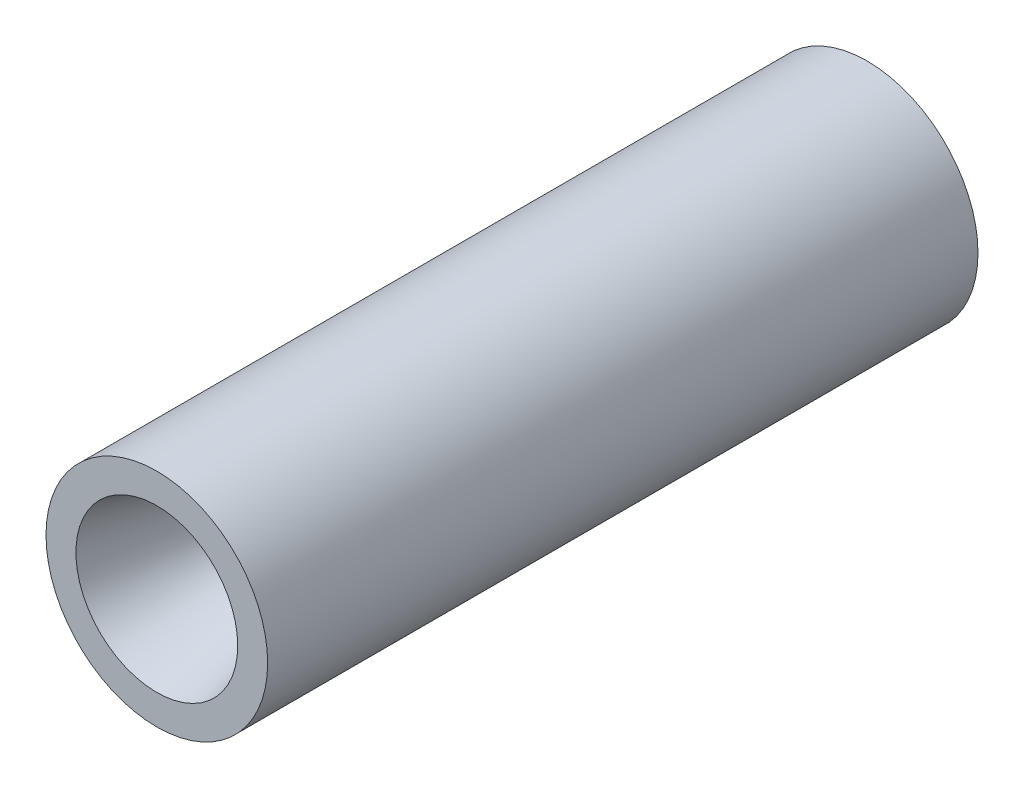
ISO-10303-21;
HEADER;
FILE_DESCRIPTION(('STEP AP214'),'2;1');
FILE_NAME('part.step','',(''),(''),'','','');
FILE_SCHEMA(('AUTOMOTIVE_DESIGN { 1 0 10303 214 1 1 1 1 }'));
ENDSEC;
DATA;
#1=APPLICATION_CONTEXT('core data for automotive mechanical design processes');
#2=APPLICATION_PROTOCOL_DEFINITION('international standard','automotive_design',2000,#1);
#3=PRODUCT_CONTEXT('',#1,'mechanical');
#4=PRODUCT('Part','Part','',(#3));
#5=PRODUCT_RELATED_PRODUCT_CATEGORY('part','',(#4));
#6=PRODUCT_DEFINITION_FORMATION('','',#4);
#7=PRODUCT_DEFINITION_CONTEXT('part definition',#1,'design');
#8=PRODUCT_DEFINITION('design','',#6,#7);
#9=PRODUCT_DEFINITION_SHAPE('','',#8);
#10=(LENGTH_UNIT() NAMED_UNIT(*) SI_UNIT(.MILLI.,.METRE.));
#11=(NAMED_UNIT(*) PLANE_ANGLE_UNIT() SI_UNIT($,.RADIAN.));
#12=(NAMED_UNIT(*) SI_UNIT($,.STERADIAN.) SOLID_ANGLE_UNIT());
#13=UNCERTAINTY_MEASURE_WITH_UNIT(LENGTH_MEASURE(1.E-05),#10,'distance_accuracy_value','');
#14=(GEOMETRIC_REPRESENTATION_CONTEXT(3) GLOBAL_UNCERTAINTY_ASSIGNED_CONTEXT((#13)) GLOBAL_UNIT_ASSIGNED_CONTEXT((#10,
#11,#12)) REPRESENTATION_CONTEXT('',''));
#15=CARTESIAN_POINT('',(0.,0.,0.));
#16=DIRECTION('',(0.,0.,1.));
#17=DIRECTION('',(1.,0.,0.));
#18=AXIS2_PLACEMENT_3D('',#15,#16,#17);
#19=CARTESIAN_POINT('',(0.,0.,81.407));
#20=DIRECTION('',(0.,0.,-1.));
#21=DIRECTION('',(-1.,0.,0.));
#22=AXIS2_PLACEMENT_3D('',#19,#20,#21);
#23=CYLINDRICAL_SURFACE('',#22,25.4);
#24=CARTESIAN_POINT('',(0.,0.,81.407));
#25=DIRECTION('',(0.,0.,1.));
#26=DIRECTION('',(1.,0.,0.));
#27=AXIS2_PLACEMENT_3D('',#24,#25,#26);
#28=CIRCLE('',#27,25.4);
#29=CARTESIAN_POINT('',(25.4,0.,81.407));
#30=VERTEX_POINT('',#29);
#31=EDGE_CURVE('E10',#30,#30,#28,.T.);
#32=ORIENTED_EDGE('',*,*,#31,.F.);
#33=EDGE_LOOP('',(#32));
#34=FACE_BOUND('',#33,.T.);
#35=CARTESIAN_POINT('',(0.,0.,-81.407));
#36=DIRECTION('',(0.,0.,1.));
#37=DIRECTION('',(1.,0.,0.));
#38=AXIS2_PLACEMENT_3D('',#35,#36,#37);
#39=CIRCLE('',#38,25.4);
#40=CARTESIAN_POINT('',(25.4,0.,-81.407));
#41=VERTEX_POINT('',#40);
#42=EDGE_CURVE('E48',#41,#41,#39,.T.);
#43=ORIENTED_EDGE('',*,*,#42,.T.);
#44=EDGE_LOOP('',(#43));
#45=FACE_BOUND('',#44,.T.);
#46=ADVANCED_FACE('F40',(#34,#45),#23,.T.);
#47=CARTESIAN_POINT('',(0.,0.,81.407));
#48=DIRECTION('',(0.,0.,1.));
#49=DIRECTION('',(1.,0.,0.));
#50=AXIS2_PLACEMENT_3D('',#47,#48,#49);
#51=PLANE('',#50);
#52=CARTESIAN_POINT('',(0.,0.,81.407));
#53=DIRECTION('',(0.,0.,-1.));
#54=DIRECTION('',(-1.,0.,0.));
#55=AXIS2_PLACEMENT_3D('',#52,#53,#54);
#56=CIRCLE('',#55,18.542);
#57=CARTESIAN_POINT('',(18.542,0.,81.407));
#58=VERTEX_POINT('',#57);
#59=EDGE_CURVE('E59',#58,#58,#56,.T.);
#60=ORIENTED_EDGE('',*,*,#59,.T.);
#61=EDGE_LOOP('',(#60));
#62=FACE_BOUND('',#61,.T.);
#63=ORIENTED_EDGE('',*,*,#31,.T.);
#64=EDGE_LOOP('',(#63));
#65=FACE_BOUND('',#64,.T.);
#66=ADVANCED_FACE('F81',(#62,#65),#51,.T.);
#67=CARTESIAN_POINT('',(0.,0.,-81.407));
#68=DIRECTION('',(0.,0.,1.));
#69=DIRECTION('',(1.,0.,0.));
#70=AXIS2_PLACEMENT_3D('',#67,#68,#69);
#71=PLANE('',#70);
#72=CARTESIAN_POINT('',(0.,0.,-81.407));
#73=DIRECTION('',(0.,0.,1.));
#74=DIRECTION('',(1.,0.,0.));
#75=AXIS2_PLACEMENT_3D('',#72,#73,#74);
#76=CIRCLE('',#75,3.81);
#77=CARTESIAN_POINT('',(3.81,0.,-81.407));
#78=VERTEX_POINT('',#77);
#79=EDGE_CURVE('E54',#78,#78,#76,.T.);
#80=ORIENTED_EDGE('',*,*,#79,.T.);
#81=EDGE_LOOP('',(#80));
#82=FACE_BOUND('',#81,.T.);
#83=ORIENTED_EDGE('',*,*,#42,.F.);
#84=EDGE_LOOP('',(#83));
#85=FACE_BOUND('',#84,.T.);
#86=ADVANCED_FACE('F78',(#82,#85),#71,.F.);
#87=CARTESIAN_POINT('',(0.,0.,-81.407));
#88=DIRECTION('',(0.,0.,1.));
#89=DIRECTION('',(1.,0.,0.));
#90=AXIS2_PLACEMENT_3D('',#87,#88,#89);
#91=CYLINDRICAL_SURFACE('',#90,3.81);
#92=CARTESIAN_POINT('',(0.,0.,26.4264275028939));
#93=DIRECTION('',(0.,0.,1.));
#94=DIRECTION('',(1.,0.,0.));
#95=AXIS2_PLACEMENT_3D('',#92,#93,#94);
#96=CIRCLE('',#95,3.81);
#97=CARTESIAN_POINT('',(3.81,0.,26.4264275028939));
#98=VERTEX_POINT('',#97);
#99=EDGE_CURVE('E43',#98,#98,#96,.T.);
#100=ORIENTED_EDGE('',*,*,#99,.T.);
#101=EDGE_LOOP('',(#100));
#102=FACE_BOUND('',#101,.T.);
#103=ORIENTED_EDGE('',*,*,#79,.F.);
#104=EDGE_LOOP('',(#103));
#105=FACE_BOUND('',#104,.T.);
#106=ADVANCED_FACE('F68',(#102,#105),#91,.F.);
#107=CARTESIAN_POINT('',(0.,0.,12.2073139260561));
#108=DIRECTION('',(0.,0.,1.));
#109=DIRECTION('',(1.,0.,0.));
#110=AXIS2_PLACEMENT_3D('',#107,#108,#109);
#111=CONICAL_SURFACE('',#110,0.,0.261799387799143);
#112=CARTESIAN_POINT('',(18.542,0.,81.407));
#113=CARTESIAN_POINT('',(18.3885416666667,0.,80.8342857031551));
#114=CARTESIAN_POINT('',(18.2350833333333,0.,80.2615714063103));
#115=CARTESIAN_POINT('',(17.9281666666667,0.,79.1161428126206));
#116=CARTESIAN_POINT('',(17.7747083333333,0.,78.5434285157757));
#117=CARTESIAN_POINT('',(17.4677916666667,0.,77.397999922086));
#118=CARTESIAN_POINT('',(17.3143333333333,0.,76.8252856252412));
#119=CARTESIAN_POINT('',(17.0074166666667,0.,75.6798570315514));
#120=CARTESIAN_POINT('',(16.8539583333333,0.,75.1071427347066));
#121=CARTESIAN_POINT('',(16.5470416666667,0.,73.9617141410169));
#122=CARTESIAN_POINT('',(16.3935833333333,0.,73.388999844172));
#123=CARTESIAN_POINT('',(16.0866666666667,0.,72.2435712504823));
#124=CARTESIAN_POINT('',(15.9332083333333,0.,71.6708569536375));
#125=CARTESIAN_POINT('',(15.6262916666667,0.,70.5254283599477));
#126=CARTESIAN_POINT('',(15.4728333333333,0.,69.9527140631029));
#127=CARTESIAN_POINT('',(15.1659166666667,0.,68.8072854694132));
#128=CARTESIAN_POINT('',(15.0124583333333,0.,68.2345711725683));
#129=CARTESIAN_POINT('',(14.7055416666667,0.,67.0891425788786));
#130=CARTESIAN_POINT('',(14.5520833333333,0.,66.5164282820337));
#131=CARTESIAN_POINT('',(14.2451666666667,0.,65.370999688344));
#132=CARTESIAN_POINT('',(14.0917083333333,0.,64.7982853914992));
#133=CARTESIAN_POINT('',(13.7847916666667,0.,63.6528567978095));
#134=CARTESIAN_POINT('',(13.6313333333333,0.,63.0801425009646));
#135=CARTESIAN_POINT('',(13.3244166666667,0.,61.9347139072749));
#136=CARTESIAN_POINT('',(13.1709583333333,0.,61.3619996104301));
#137=CARTESIAN_POINT('',(12.8640416666667,0.,60.2165710167403));
#138=CARTESIAN_POINT('',(12.7105833333333,0.,59.6438567198955));
#139=CARTESIAN_POINT('',(12.4036666666667,0.,58.4984281262058));
#140=CARTESIAN_POINT('',(12.2502083333333,0.,57.9257138293609));
#141=CARTESIAN_POINT('',(11.9432916666667,0.,56.7802852356712));
#142=CARTESIAN_POINT('',(11.7898333333333,0.,56.2075709388264));
#143=CARTESIAN_POINT('',(11.4829166666667,0.,55.0621423451366));
#144=CARTESIAN_POINT('',(11.3294583333333,0.,54.4894280482918));
#145=CARTESIAN_POINT('',(11.0225416666667,0.,53.3439994546021));
#146=CARTESIAN_POINT('',(10.8690833333333,0.,52.7712851577572));
#147=CARTESIAN_POINT('',(10.5621666666667,0.,51.6258565640675));
#148=CARTESIAN_POINT('',(10.4087083333333,0.,51.0531422672227));
#149=CARTESIAN_POINT('',(10.1017916666667,0.,49.9077136735329));
#150=CARTESIAN_POINT('',(9.94833333333333,0.,49.3349993766881));
#151=CARTESIAN_POINT('',(9.64141666666667,0.,48.1895707829984));
#152=CARTESIAN_POINT('',(9.48795833333333,0.,47.6168564861535));
#153=CARTESIAN_POINT('',(9.18104166666667,0.,46.4714278924638));
#154=CARTESIAN_POINT('',(9.02758333333333,0.,45.898713595619));
#155=CARTESIAN_POINT('',(8.72066666666667,0.,44.7532850019292));
#156=CARTESIAN_POINT('',(8.56720833333333,0.,44.1805707050844));
#157=CARTESIAN_POINT('',(8.26029166666667,0.,43.0351421113947));
#158=CARTESIAN_POINT('',(8.10683333333333,0.,42.4624278145498));
#159=CARTESIAN_POINT('',(7.79991666666667,0.,41.3169992208601));
#160=CARTESIAN_POINT('',(7.64645833333333,0.,40.7442849240153));
#161=CARTESIAN_POINT('',(7.33954166666667,0.,39.5988563303255));
#162=CARTESIAN_POINT('',(7.18608333333334,0.,39.0261420334807));
#163=CARTESIAN_POINT('',(6.87916666666667,0.,37.880713439791));
#164=CARTESIAN_POINT('',(6.72570833333333,0.,37.3079991429461));
#165=CARTESIAN_POINT('',(6.41879166666667,0.,36.1625705492564));
#166=CARTESIAN_POINT('',(6.26533333333333,0.,35.5898562524116));
#167=CARTESIAN_POINT('',(5.95841666666667,0.,34.4444276587218));
#168=CARTESIAN_POINT('',(5.80495833333333,0.,33.871713361877));
#169=CARTESIAN_POINT('',(5.49804166666667,0.,32.7262847681873));
#170=CARTESIAN_POINT('',(5.34458333333333,0.,32.1535704713424));
#171=CARTESIAN_POINT('',(5.03766666666667,0.,31.0081418776527));
#172=CARTESIAN_POINT('',(4.88420833333333,0.,30.4354275808079));
#173=CARTESIAN_POINT('',(4.57729166666667,0.,29.2899989871181));
#174=CARTESIAN_POINT('',(4.42383333333334,0.,28.7172846902733));
#175=CARTESIAN_POINT('',(4.11691666666667,0.,27.5718560965836));
#176=CARTESIAN_POINT('',(3.96345833333333,0.,26.9991417997387));
#177=CARTESIAN_POINT('',(3.81,0.,26.4264275028939));
#178=B_SPLINE_CURVE_WITH_KNOTS('',3,(#112,#113,#114,#115,#116,#117,#118,#119,#120,#121,#122,
#123,#124,#125,#126,#127,#128,#129,#130,#131,#132,#133,#134,#135,#136,#137,#138,#139,#140,#141,
#142,#143,#144,#145,#146,#147,#148,#149,#150,#151,#152,#153,#154,#155,#156,#157,#158,#159,#160,
#161,#162,#163,#164,#165,#166,#167,#168,#169,#170,#171,#172,#173,#174,#175,#176,#177),
.UNSPECIFIED.,.F.,.F.,(4,2,2,2,2,2,2,2,2,2,2,2,2,2,2,2,2,2,2,2,2,2,2,2,2,2,2,2,2,2,2,2,4),(0.,
1.77875240911136,3.55750481822273,5.33625722733409,7.11500963644544,8.89376204555681,
10.6725144546682,12.4512668637795,14.2300192728909,16.0087716820023,17.7875240911136,
19.566276500225,21.3450289093363,23.1237813184477,24.9025337275591,26.6812861366704,
28.4600385457818,30.2387909548932,32.0175433640045,33.7962957731159,35.5750481822272,
37.3538005913386,39.13255300045,40.9113054095613,42.6900578186727,44.4688102277841,
46.2475626368954,48.0263150460068,49.8050674551181,51.5838198642295,53.3625722733409,
55.1413246824522,56.9200770915636),.UNSPECIFIED.);
#179=EDGE_CURVE('BSEAM71',#58,#98,#178,.T.);
#180=ORIENTED_EDGE('',*,*,#59,.F.);
#181=ORIENTED_EDGE('',*,*,#99,.F.);
#182=ORIENTED_EDGE('',*,*,#179,.T.);
#183=ORIENTED_EDGE('',*,*,#179,.F.);
#184=EDGE_LOOP('',(#180,#182,#181,#183));
#185=FACE_BOUND('',#184,.T.);
#186=ADVANCED_FACE('F71',(#185),#111,.F.);
#187=CLOSED_SHELL('',(#46,#66,#86,#106,#186));
#188=MANIFOLD_SOLID_BREP('B2',#187);
#189=ADVANCED_BREP_SHAPE_REPRESENTATION('',(#18,#188),#14);
#190=SHAPE_DEFINITION_REPRESENTATION(#9,#189);
ENDSEC;
END-ISO-10303-21;
